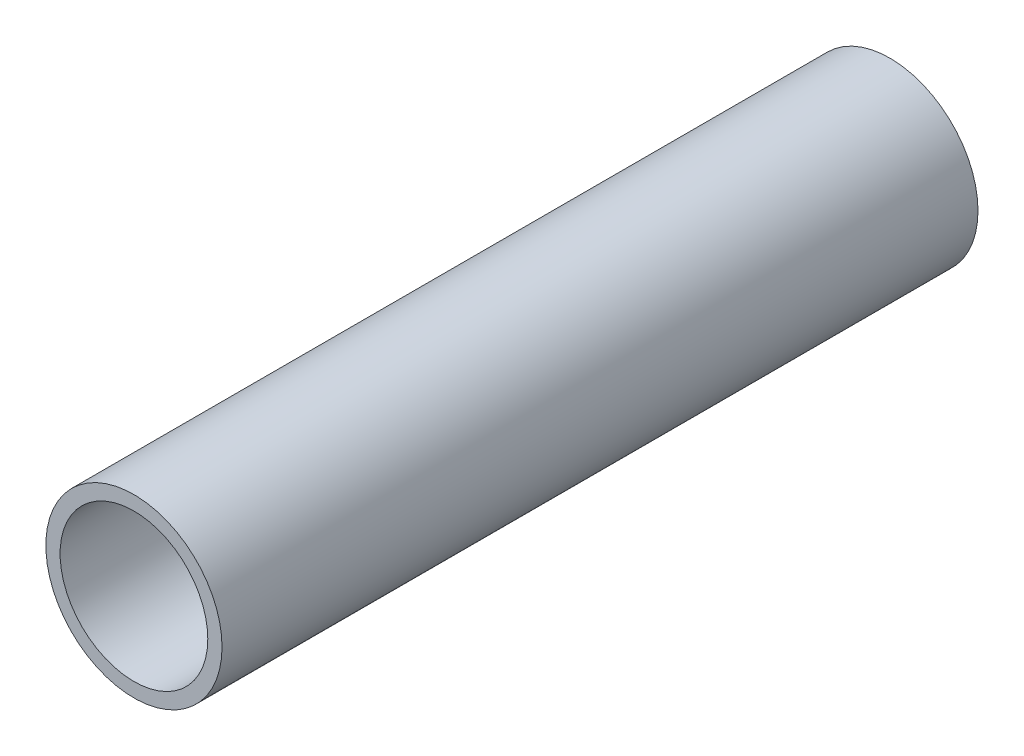
ISO-10303-21;
HEADER;
FILE_DESCRIPTION(('STEP AP214'),'2;1');
FILE_NAME('part.step','',(''),(''),'','','');
FILE_SCHEMA(('AUTOMOTIVE_DESIGN { 1 0 10303 214 1 1 1 1 }'));
ENDSEC;
DATA;
#1=APPLICATION_CONTEXT('core data for automotive mechanical design processes');
#2=APPLICATION_PROTOCOL_DEFINITION('international standard','automotive_design',2000,#1);
#3=PRODUCT_CONTEXT('',#1,'mechanical');
#4=PRODUCT('Part','Part','',(#3));
#5=PRODUCT_RELATED_PRODUCT_CATEGORY('part','',(#4));
#6=PRODUCT_DEFINITION_FORMATION('','',#4);
#7=PRODUCT_DEFINITION_CONTEXT('part definition',#1,'design');
#8=PRODUCT_DEFINITION('design','',#6,#7);
#9=PRODUCT_DEFINITION_SHAPE('','',#8);
#10=(LENGTH_UNIT() NAMED_UNIT(*) SI_UNIT(.MILLI.,.METRE.));
#11=(NAMED_UNIT(*) PLANE_ANGLE_UNIT() SI_UNIT($,.RADIAN.));
#12=(NAMED_UNIT(*) SI_UNIT($,.STERADIAN.) SOLID_ANGLE_UNIT());
#13=UNCERTAINTY_MEASURE_WITH_UNIT(LENGTH_MEASURE(1.E-05),#10,'distance_accuracy_value','');
#14=(GEOMETRIC_REPRESENTATION_CONTEXT(3) GLOBAL_UNCERTAINTY_ASSIGNED_CONTEXT((#13)) GLOBAL_UNIT_ASSIGNED_CONTEXT((#10,
#11,#12)) REPRESENTATION_CONTEXT('',''));
#15=CARTESIAN_POINT('',(0.,0.,0.));
#16=DIRECTION('',(0.,0.,1.));
#17=DIRECTION('',(1.,0.,0.));
#18=AXIS2_PLACEMENT_3D('',#15,#16,#17);
#19=CARTESIAN_POINT('',(0.,0.,260.));
#20=DIRECTION('',(0.,0.,1.));
#21=DIRECTION('',(1.,0.,0.));
#22=AXIS2_PLACEMENT_3D('',#19,#20,#21);
#23=PLANE('',#22);
#24=CARTESIAN_POINT('',(0.,0.,260.));
#25=DIRECTION('',(0.,0.,1.));
#26=DIRECTION('',(1.,0.,0.));
#27=AXIS2_PLACEMENT_3D('',#24,#25,#26);
#28=CIRCLE('',#27,30.3);
#29=CARTESIAN_POINT('',(30.3,0.,260.));
#30=VERTEX_POINT('',#29);
#31=EDGE_CURVE('E10',#30,#30,#28,.T.);
#32=ORIENTED_EDGE('',*,*,#31,.T.);
#33=EDGE_LOOP('',(#32));
#34=FACE_BOUND('',#33,.T.);
#35=CARTESIAN_POINT('',(0.,0.,260.));
#36=DIRECTION('',(0.,0.,1.));
#37=DIRECTION('',(1.,0.,0.));
#38=AXIS2_PLACEMENT_3D('',#35,#36,#37);
#39=CIRCLE('',#38,25.4);
#40=CARTESIAN_POINT('',(25.4,0.,260.));
#41=VERTEX_POINT('',#40);
#42=EDGE_CURVE('E54',#41,#41,#39,.T.);
#43=ORIENTED_EDGE('',*,*,#42,.F.);
#44=EDGE_LOOP('',(#43));
#45=FACE_BOUND('',#44,.T.);
#46=ADVANCED_FACE('F41',(#34,#45),#23,.T.);
#47=CARTESIAN_POINT('',(0.,0.,0.));
#48=DIRECTION('',(0.,0.,1.));
#49=DIRECTION('',(1.,0.,0.));
#50=AXIS2_PLACEMENT_3D('',#47,#48,#49);
#51=PLANE('',#50);
#52=CARTESIAN_POINT('',(0.,0.,0.));
#53=DIRECTION('',(0.,0.,1.));
#54=DIRECTION('',(1.,0.,0.));
#55=AXIS2_PLACEMENT_3D('',#52,#53,#54);
#56=CIRCLE('',#55,30.3);
#57=CARTESIAN_POINT('',(30.3,0.,0.));
#58=VERTEX_POINT('',#57);
#59=EDGE_CURVE('E45',#58,#58,#56,.T.);
#60=ORIENTED_EDGE('',*,*,#59,.F.);
#61=EDGE_LOOP('',(#60));
#62=FACE_BOUND('',#61,.T.);
#63=CARTESIAN_POINT('',(0.,0.,0.));
#64=DIRECTION('',(0.,0.,1.));
#65=DIRECTION('',(1.,0.,0.));
#66=AXIS2_PLACEMENT_3D('',#63,#64,#65);
#67=CIRCLE('',#66,25.4);
#68=CARTESIAN_POINT('',(25.4,0.,0.));
#69=VERTEX_POINT('',#68);
#70=EDGE_CURVE('E56',#69,#69,#67,.T.);
#71=ORIENTED_EDGE('',*,*,#70,.T.);
#72=EDGE_LOOP('',(#71));
#73=FACE_BOUND('',#72,.T.);
#74=ADVANCED_FACE('F68',(#62,#73),#51,.F.);
#75=CARTESIAN_POINT('',(0.,0.,260.));
#76=DIRECTION('',(0.,0.,-1.));
#77=DIRECTION('',(-1.,0.,0.));
#78=AXIS2_PLACEMENT_3D('',#75,#76,#77);
#79=CYLINDRICAL_SURFACE('',#78,30.3);
#80=ORIENTED_EDGE('',*,*,#31,.F.);
#81=EDGE_LOOP('',(#80));
#82=FACE_BOUND('',#81,.T.);
#83=ORIENTED_EDGE('',*,*,#59,.T.);
#84=EDGE_LOOP('',(#83));
#85=FACE_BOUND('',#84,.T.);
#86=ADVANCED_FACE('F43',(#82,#85),#79,.T.);
#87=CARTESIAN_POINT('',(0.,0.,260.));
#88=DIRECTION('',(0.,0.,-1.));
#89=DIRECTION('',(-1.,0.,0.));
#90=AXIS2_PLACEMENT_3D('',#87,#88,#89);
#91=CYLINDRICAL_SURFACE('',#90,25.4);
#92=ORIENTED_EDGE('',*,*,#42,.T.);
#93=EDGE_LOOP('',(#92));
#94=FACE_BOUND('',#93,.T.);
#95=ORIENTED_EDGE('',*,*,#70,.F.);
#96=EDGE_LOOP('',(#95));
#97=FACE_BOUND('',#96,.T.);
#98=ADVANCED_FACE('F64',(#94,#97),#91,.F.);
#99=CLOSED_SHELL('',(#46,#74,#86,#98));
#100=MANIFOLD_SOLID_BREP('B2',#99);
#101=ADVANCED_BREP_SHAPE_REPRESENTATION('',(#18,#100),#14);
#102=SHAPE_DEFINITION_REPRESENTATION(#9,#101);
ENDSEC;
END-ISO-10303-21;
